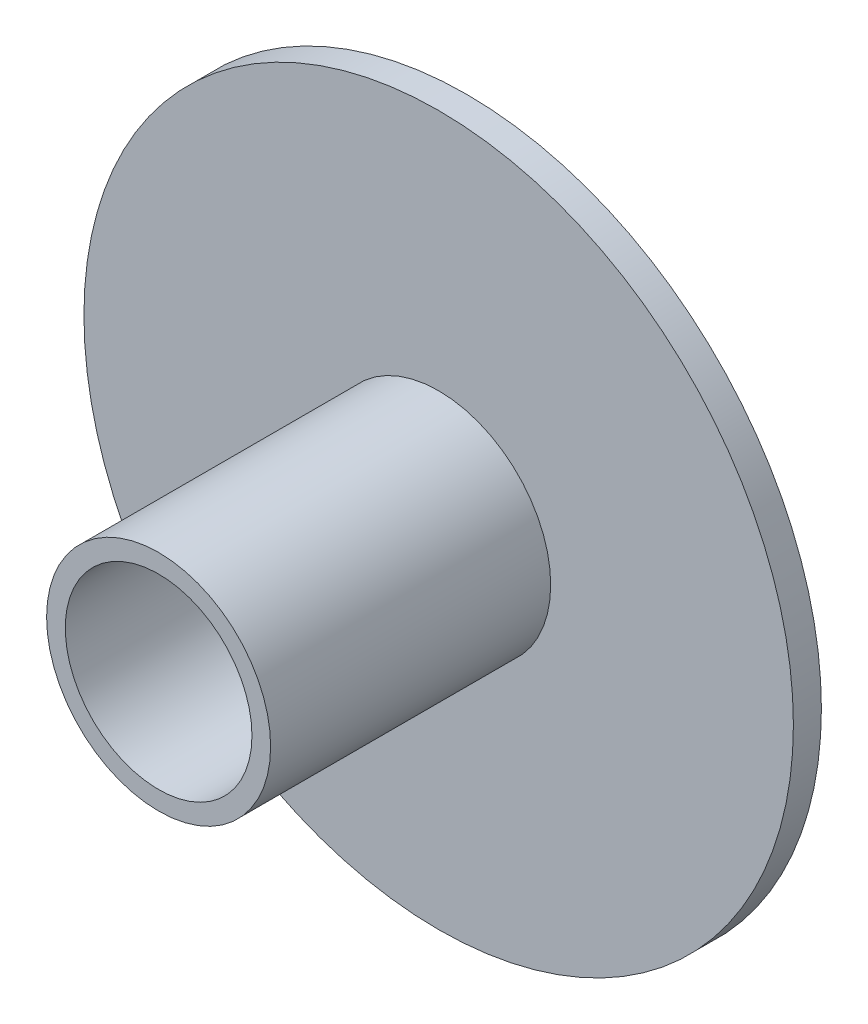
ISO-10303-21;
HEADER;
FILE_DESCRIPTION(('STEP AP214'),'2;1');
FILE_NAME('part.step','',(''),(''),'','','');
FILE_SCHEMA(('AUTOMOTIVE_DESIGN { 1 0 10303 214 1 1 1 1 }'));
ENDSEC;
DATA;
#1=APPLICATION_CONTEXT('core data for automotive mechanical design processes');
#2=APPLICATION_PROTOCOL_DEFINITION('international standard','automotive_design',2000,#1);
#3=PRODUCT_CONTEXT('',#1,'mechanical');
#4=PRODUCT('Part','Part','',(#3));
#5=PRODUCT_RELATED_PRODUCT_CATEGORY('part','',(#4));
#6=PRODUCT_DEFINITION_FORMATION('','',#4);
#7=PRODUCT_DEFINITION_CONTEXT('part definition',#1,'design');
#8=PRODUCT_DEFINITION('design','',#6,#7);
#9=PRODUCT_DEFINITION_SHAPE('','',#8);
#10=(LENGTH_UNIT() NAMED_UNIT(*) SI_UNIT(.MILLI.,.METRE.));
#11=(NAMED_UNIT(*) PLANE_ANGLE_UNIT() SI_UNIT($,.RADIAN.));
#12=(NAMED_UNIT(*) SI_UNIT($,.STERADIAN.) SOLID_ANGLE_UNIT());
#13=UNCERTAINTY_MEASURE_WITH_UNIT(LENGTH_MEASURE(1.E-05),#10,'distance_accuracy_value','');
#14=(GEOMETRIC_REPRESENTATION_CONTEXT(3) GLOBAL_UNCERTAINTY_ASSIGNED_CONTEXT((#13)) GLOBAL_UNIT_ASSIGNED_CONTEXT((#10,
#11,#12)) REPRESENTATION_CONTEXT('',''));
#15=CARTESIAN_POINT('',(0.,0.,0.));
#16=DIRECTION('',(0.,0.,1.));
#17=DIRECTION('',(1.,0.,0.));
#18=AXIS2_PLACEMENT_3D('',#15,#16,#17);
#19=CARTESIAN_POINT('',(0.,0.,1.5));
#20=DIRECTION('',(0.,0.,-1.));
#21=DIRECTION('',(-1.,0.,0.));
#22=AXIS2_PLACEMENT_3D('',#19,#20,#21);
#23=CYLINDRICAL_SURFACE('',#22,19.);
#24=CARTESIAN_POINT('',(0.,0.,1.5));
#25=DIRECTION('',(0.,0.,1.));
#26=DIRECTION('',(1.,0.,0.));
#27=AXIS2_PLACEMENT_3D('',#24,#25,#26);
#28=CIRCLE('',#27,19.);
#29=CARTESIAN_POINT('',(19.,0.,1.5));
#30=VERTEX_POINT('',#29);
#31=EDGE_CURVE('E10',#30,#30,#28,.T.);
#32=ORIENTED_EDGE('',*,*,#31,.F.);
#33=EDGE_LOOP('',(#32));
#34=FACE_BOUND('',#33,.T.);
#35=CARTESIAN_POINT('',(0.,0.,0.));
#36=DIRECTION('',(0.,0.,1.));
#37=DIRECTION('',(1.,0.,0.));
#38=AXIS2_PLACEMENT_3D('',#35,#36,#37);
#39=CIRCLE('',#38,19.);
#40=CARTESIAN_POINT('',(19.,0.,0.));
#41=VERTEX_POINT('',#40);
#42=EDGE_CURVE('E40',#41,#41,#39,.T.);
#43=ORIENTED_EDGE('',*,*,#42,.T.);
#44=EDGE_LOOP('',(#43));
#45=FACE_BOUND('',#44,.T.);
#46=ADVANCED_FACE('F33',(#34,#45),#23,.T.);
#47=CARTESIAN_POINT('',(0.,0.,1.5));
#48=DIRECTION('',(0.,0.,1.));
#49=DIRECTION('',(1.,0.,0.));
#50=AXIS2_PLACEMENT_3D('',#47,#48,#49);
#51=PLANE('',#50);
#52=CARTESIAN_POINT('',(0.,0.,1.5));
#53=DIRECTION('',(0.,0.,1.));
#54=DIRECTION('',(1.,0.,0.));
#55=AXIS2_PLACEMENT_3D('',#52,#53,#54);
#56=CIRCLE('',#55,6.);
#57=CARTESIAN_POINT('',(6.,0.,1.5));
#58=VERTEX_POINT('',#57);
#59=EDGE_CURVE('E47',#58,#58,#56,.T.);
#60=ORIENTED_EDGE('',*,*,#59,.F.);
#61=EDGE_LOOP('',(#60));
#62=FACE_BOUND('',#61,.T.);
#63=ORIENTED_EDGE('',*,*,#31,.T.);
#64=EDGE_LOOP('',(#63));
#65=FACE_BOUND('',#64,.T.);
#66=ADVANCED_FACE('F75',(#62,#65),#51,.T.);
#67=CARTESIAN_POINT('',(0.,0.,0.));
#68=DIRECTION('',(0.,0.,1.));
#69=DIRECTION('',(1.,0.,0.));
#70=AXIS2_PLACEMENT_3D('',#67,#68,#69);
#71=PLANE('',#70);
#72=CARTESIAN_POINT('',(0.,0.,0.));
#73=DIRECTION('',(0.,0.,1.));
#74=DIRECTION('',(1.,0.,0.));
#75=AXIS2_PLACEMENT_3D('',#72,#73,#74);
#76=CIRCLE('',#75,5.);
#77=CARTESIAN_POINT('',(5.,0.,0.));
#78=VERTEX_POINT('',#77);
#79=EDGE_CURVE('E52',#78,#78,#76,.T.);
#80=ORIENTED_EDGE('',*,*,#79,.T.);
#81=EDGE_LOOP('',(#80));
#82=FACE_BOUND('',#81,.T.);
#83=ORIENTED_EDGE('',*,*,#42,.F.);
#84=EDGE_LOOP('',(#83));
#85=FACE_BOUND('',#84,.T.);
#86=ADVANCED_FACE('F71',(#82,#85),#71,.F.);
#87=CARTESIAN_POINT('',(0.,0.,16.5));
#88=DIRECTION('',(0.,0.,-1.));
#89=DIRECTION('',(-1.,0.,0.));
#90=AXIS2_PLACEMENT_3D('',#87,#88,#89);
#91=CYLINDRICAL_SURFACE('',#90,6.);
#92=CARTESIAN_POINT('',(0.,0.,16.5));
#93=DIRECTION('',(0.,0.,1.));
#94=DIRECTION('',(1.,0.,0.));
#95=AXIS2_PLACEMENT_3D('',#92,#93,#94);
#96=CIRCLE('',#95,6.);
#97=CARTESIAN_POINT('',(6.,0.,16.5));
#98=VERTEX_POINT('',#97);
#99=EDGE_CURVE('E45',#98,#98,#96,.T.);
#100=ORIENTED_EDGE('',*,*,#99,.F.);
#101=EDGE_LOOP('',(#100));
#102=FACE_BOUND('',#101,.T.);
#103=ORIENTED_EDGE('',*,*,#59,.T.);
#104=EDGE_LOOP('',(#103));
#105=FACE_BOUND('',#104,.T.);
#106=ADVANCED_FACE('F65',(#102,#105),#91,.T.);
#107=CARTESIAN_POINT('',(0.,0.,16.5));
#108=DIRECTION('',(0.,0.,1.));
#109=DIRECTION('',(1.,0.,0.));
#110=AXIS2_PLACEMENT_3D('',#107,#108,#109);
#111=PLANE('',#110);
#112=CARTESIAN_POINT('',(0.,0.,16.5));
#113=DIRECTION('',(0.,0.,1.));
#114=DIRECTION('',(1.,0.,0.));
#115=AXIS2_PLACEMENT_3D('',#112,#113,#114);
#116=CIRCLE('',#115,5.);
#117=CARTESIAN_POINT('',(5.,0.,16.5));
#118=VERTEX_POINT('',#117);
#119=EDGE_CURVE('E36',#118,#118,#116,.T.);
#120=ORIENTED_EDGE('',*,*,#119,.F.);
#121=EDGE_LOOP('',(#120));
#122=FACE_BOUND('',#121,.T.);
#123=ORIENTED_EDGE('',*,*,#99,.T.);
#124=EDGE_LOOP('',(#123));
#125=FACE_BOUND('',#124,.T.);
#126=ADVANCED_FACE('F62',(#122,#125),#111,.T.);
#127=CARTESIAN_POINT('',(0.,0.,0.));
#128=DIRECTION('',(0.,0.,1.));
#129=DIRECTION('',(1.,0.,0.));
#130=AXIS2_PLACEMENT_3D('',#127,#128,#129);
#131=CYLINDRICAL_SURFACE('',#130,5.);
#132=ORIENTED_EDGE('',*,*,#119,.T.);
#133=EDGE_LOOP('',(#132));
#134=FACE_BOUND('',#133,.T.);
#135=ORIENTED_EDGE('',*,*,#79,.F.);
#136=EDGE_LOOP('',(#135));
#137=FACE_BOUND('',#136,.T.);
#138=ADVANCED_FACE('F59',(#134,#137),#131,.F.);
#139=CLOSED_SHELL('',(#46,#66,#86,#106,#126,#138));
#140=MANIFOLD_SOLID_BREP('B2',#139);
#141=ADVANCED_BREP_SHAPE_REPRESENTATION('',(#18,#140),#14);
#142=SHAPE_DEFINITION_REPRESENTATION(#9,#141);
ENDSEC;
END-ISO-10303-21;
